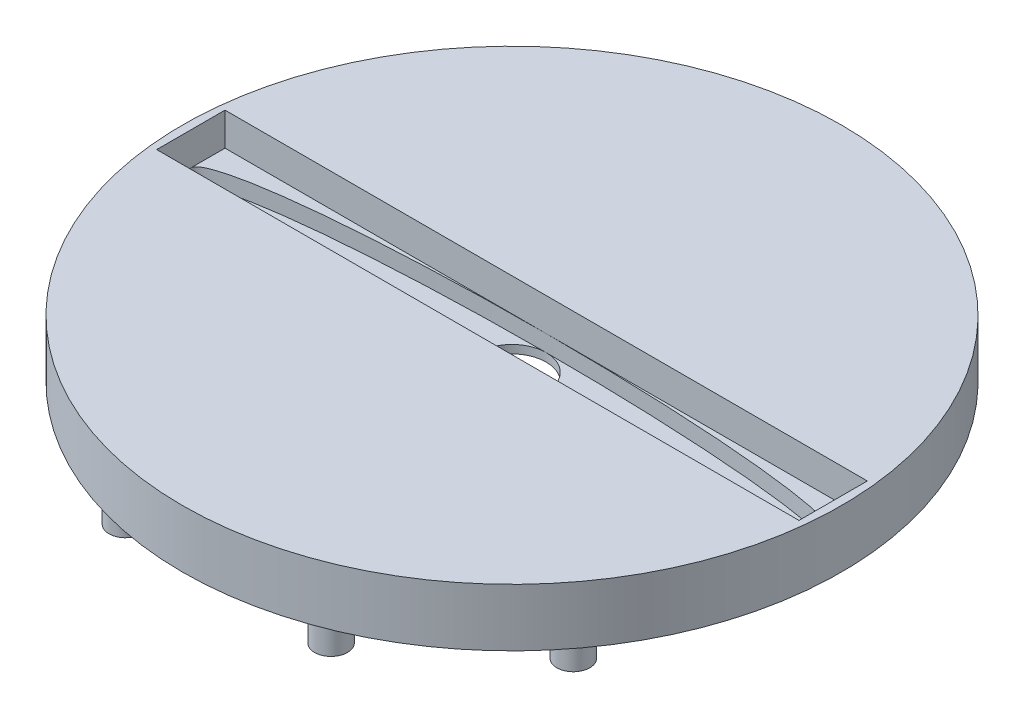
ISO-10303-21;
HEADER;
FILE_DESCRIPTION(('STEP AP214'),'2;1');
FILE_NAME('part.step','',(''),(''),'','','');
FILE_SCHEMA(('AUTOMOTIVE_DESIGN { 1 0 10303 214 1 1 1 1 }'));
ENDSEC;
DATA;
#1=APPLICATION_CONTEXT('core data for automotive mechanical design processes');
#2=APPLICATION_PROTOCOL_DEFINITION('international standard','automotive_design',2000,#1);
#3=PRODUCT_CONTEXT('',#1,'mechanical');
#4=PRODUCT('Part','Part','',(#3));
#5=PRODUCT_RELATED_PRODUCT_CATEGORY('part','',(#4));
#6=PRODUCT_DEFINITION_FORMATION('','',#4);
#7=PRODUCT_DEFINITION_CONTEXT('part definition',#1,'design');
#8=PRODUCT_DEFINITION('design','',#6,#7);
#9=PRODUCT_DEFINITION_SHAPE('','',#8);
#10=(LENGTH_UNIT() NAMED_UNIT(*) SI_UNIT(.MILLI.,.METRE.));
#11=(NAMED_UNIT(*) PLANE_ANGLE_UNIT() SI_UNIT($,.RADIAN.));
#12=(NAMED_UNIT(*) SI_UNIT($,.STERADIAN.) SOLID_ANGLE_UNIT());
#13=UNCERTAINTY_MEASURE_WITH_UNIT(LENGTH_MEASURE(1.E-05),#10,'distance_accuracy_value','');
#14=(GEOMETRIC_REPRESENTATION_CONTEXT(3) GLOBAL_UNCERTAINTY_ASSIGNED_CONTEXT((#13)) GLOBAL_UNIT_ASSIGNED_CONTEXT((#10,
#11,#12)) REPRESENTATION_CONTEXT('',''));
#15=CARTESIAN_POINT('',(0.,0.,0.));
#16=DIRECTION('',(0.,0.,1.));
#17=DIRECTION('',(1.,0.,0.));
#18=AXIS2_PLACEMENT_3D('',#15,#16,#17);
#19=CARTESIAN_POINT('',(0.,1.,0.));
#20=DIRECTION('',(0.,1.,0.));
#21=DIRECTION('',(0.,0.,1.));
#22=AXIS2_PLACEMENT_3D('',#19,#20,#21);
#23=PLANE('',#22);
#24=CARTESIAN_POINT('',(0.,1.,0.));
#25=DIRECTION('',(0.,1.,0.));
#26=DIRECTION('',(0.,0.,1.));
#27=AXIS2_PLACEMENT_3D('',#24,#25,#26);
#28=CIRCLE('',#27,4.15);
#29=CARTESIAN_POINT('',(0.,1.,4.15));
#30=VERTEX_POINT('',#29);
#31=CARTESIAN_POINT('',(0.,1.,-4.15));
#32=VERTEX_POINT('',#31);
#33=EDGE_CURVE('E77',#30,#32,#28,.T.);
#34=ORIENTED_EDGE('',*,*,#33,.F.);
#35=CARTESIAN_POINT('',(0.,1.,0.));
#36=DIRECTION('',(0.,1.,0.));
#37=DIRECTION('',(1.,0.,0.));
#38=AXIS2_PLACEMENT_3D('',#35,#36,#37);
#39=ELLIPSE('',#38,39.,4.15);
#40=EDGE_CURVE('E126',#30,#32,#39,.T.);
#41=ORIENTED_EDGE('',*,*,#40,.T.);
#42=EDGE_LOOP('',(#34,#41));
#43=FACE_BOUND('',#42,.T.);
#44=ADVANCED_FACE('F60',(#43),#23,.T.);
#45=CARTESIAN_POINT('',(0.,3.,0.));
#46=DIRECTION('',(0.,1.,0.));
#47=DIRECTION('',(0.,0.,1.));
#48=AXIS2_PLACEMENT_3D('',#45,#46,#47);
#49=PLANE('',#48);
#50=CARTESIAN_POINT('',(0.,3.,0.));
#51=DIRECTION('',(0.,1.,0.));
#52=DIRECTION('',(1.,0.,0.));
#53=AXIS2_PLACEMENT_3D('',#50,#51,#52);
#54=ELLIPSE('',#53,39.,4.15);
#55=CARTESIAN_POINT('',(39.,3.,0.));
#56=VERTEX_POINT('',#55);
#57=CARTESIAN_POINT('',(0.,3.,-4.15));
#58=VERTEX_POINT('',#57);
#59=EDGE_CURVE('E71',#56,#58,#54,.T.);
#60=ORIENTED_EDGE('',*,*,#59,.F.);
#61=DIRECTION('',(0.,0.,-1.));
#62=VECTOR('',#61,1.);
#63=CARTESIAN_POINT('',(39.,3.,0.));
#64=LINE('',#63,#62);
#65=CARTESIAN_POINT('',(39.,3.,-4.15));
#66=VERTEX_POINT('',#65);
#67=EDGE_CURVE('E496',#56,#66,#64,.T.);
#68=ORIENTED_EDGE('',*,*,#67,.T.);
#69=DIRECTION('',(1.,0.,0.));
#70=VECTOR('',#69,1.);
#71=CARTESIAN_POINT('',(0.,3.,-4.15));
#72=LINE('',#71,#70);
#73=EDGE_CURVE('E493',#58,#66,#72,.T.);
#74=ORIENTED_EDGE('',*,*,#73,.F.);
#75=EDGE_LOOP('',(#60,#68,#74));
#76=FACE_BOUND('',#75,.T.);
#77=ADVANCED_FACE('F148',(#76),#49,.T.);
#78=CARTESIAN_POINT('',(-39.,3.,0.));
#79=VERTEX_POINT('',#78);
#80=EDGE_CURVE('E12',#58,#79,#54,.T.);
#81=ORIENTED_EDGE('',*,*,#80,.F.);
#82=CARTESIAN_POINT('',(-39.,3.,-4.15));
#83=VERTEX_POINT('',#82);
#84=EDGE_CURVE('E490',#83,#58,#72,.T.);
#85=ORIENTED_EDGE('',*,*,#84,.F.);
#86=DIRECTION('',(0.,0.,-1.));
#87=VECTOR('',#86,1.);
#88=CARTESIAN_POINT('',(-39.,3.,0.));
#89=LINE('',#88,#87);
#90=EDGE_CURVE('E489',#79,#83,#89,.T.);
#91=ORIENTED_EDGE('',*,*,#90,.F.);
#92=EDGE_LOOP('',(#81,#85,#91));
#93=FACE_BOUND('',#92,.T.);
#94=ADVANCED_FACE('F211',(#93),#49,.T.);
#95=CARTESIAN_POINT('',(0.,3.,4.15));
#96=VERTEX_POINT('',#95);
#97=EDGE_CURVE('E69',#79,#96,#54,.T.);
#98=ORIENTED_EDGE('',*,*,#97,.F.);
#99=CARTESIAN_POINT('',(-39.,3.,4.15));
#100=VERTEX_POINT('',#99);
#101=EDGE_CURVE('E473',#100,#79,#89,.T.);
#102=ORIENTED_EDGE('',*,*,#101,.F.);
#103=DIRECTION('',(1.,0.,0.));
#104=VECTOR('',#103,1.);
#105=CARTESIAN_POINT('',(0.,3.,4.15));
#106=LINE('',#105,#104);
#107=EDGE_CURVE('E497',#100,#96,#106,.T.);
#108=ORIENTED_EDGE('',*,*,#107,.T.);
#109=EDGE_LOOP('',(#98,#102,#108));
#110=FACE_BOUND('',#109,.T.);
#111=ADVANCED_FACE('F149',(#110),#49,.T.);
#112=CARTESIAN_POINT('',(0.,7.,0.));
#113=DIRECTION('',(0.,-1.,0.));
#114=DIRECTION('',(0.,0.,-1.));
#115=AXIS2_PLACEMENT_3D('',#112,#113,#114);
#116=CYLINDRICAL_SURFACE('',#115,40.0200280181617);
#117=CARTESIAN_POINT('',(0.,7.,0.));
#118=DIRECTION('',(0.,1.,0.));
#119=DIRECTION('',(0.,0.,1.));
#120=AXIS2_PLACEMENT_3D('',#117,#118,#119);
#121=CIRCLE('',#120,40.0200280181617);
#122=CARTESIAN_POINT('',(0.,7.,40.0200280181617));
#123=VERTEX_POINT('',#122);
#124=EDGE_CURVE('E436',#123,#123,#121,.T.);
#125=ORIENTED_EDGE('',*,*,#124,.F.);
#126=EDGE_LOOP('',(#125));
#127=FACE_BOUND('',#126,.T.);
#128=CARTESIAN_POINT('',(0.,0.,0.));
#129=DIRECTION('',(0.,1.,0.));
#130=DIRECTION('',(0.,0.,1.));
#131=AXIS2_PLACEMENT_3D('',#128,#129,#130);
#132=CIRCLE('',#131,40.0200280181617);
#133=CARTESIAN_POINT('',(0.,0.,40.0200280181617));
#134=VERTEX_POINT('',#133);
#135=EDGE_CURVE('E439',#134,#134,#132,.T.);
#136=ORIENTED_EDGE('',*,*,#135,.T.);
#137=EDGE_LOOP('',(#136));
#138=FACE_BOUND('',#137,.T.);
#139=ADVANCED_FACE('F62',(#127,#138),#116,.T.);
#140=CARTESIAN_POINT('',(0.,7.,0.));
#141=DIRECTION('',(0.,1.,0.));
#142=DIRECTION('',(0.,0.,1.));
#143=AXIS2_PLACEMENT_3D('',#140,#141,#142);
#144=PLANE('',#143);
#145=DIRECTION('',(1.,0.,0.));
#146=VECTOR('',#145,1.);
#147=CARTESIAN_POINT('',(0.,7.,4.15));
#148=LINE('',#147,#146);
#149=CARTESIAN_POINT('',(-39.,7.,4.15));
#150=VERTEX_POINT('',#149);
#151=CARTESIAN_POINT('',(39.,7.,4.15));
#152=VERTEX_POINT('',#151);
#153=EDGE_CURVE('E133',#150,#152,#148,.T.);
#154=ORIENTED_EDGE('',*,*,#153,.F.);
#155=DIRECTION('',(0.,0.,-1.));
#156=VECTOR('',#155,1.);
#157=CARTESIAN_POINT('',(-39.,7.,0.));
#158=LINE('',#157,#156);
#159=CARTESIAN_POINT('',(-39.,7.,-4.15));
#160=VERTEX_POINT('',#159);
#161=EDGE_CURVE('E478',#150,#160,#158,.T.);
#162=ORIENTED_EDGE('',*,*,#161,.T.);
#163=DIRECTION('',(1.,0.,0.));
#164=VECTOR('',#163,1.);
#165=CARTESIAN_POINT('',(0.,7.,-4.15));
#166=LINE('',#165,#164);
#167=CARTESIAN_POINT('',(39.,7.,-4.15));
#168=VERTEX_POINT('',#167);
#169=EDGE_CURVE('E482',#160,#168,#166,.T.);
#170=ORIENTED_EDGE('',*,*,#169,.T.);
#171=DIRECTION('',(0.,0.,-1.));
#172=VECTOR('',#171,1.);
#173=CARTESIAN_POINT('',(39.,7.,0.));
#174=LINE('',#173,#172);
#175=EDGE_CURVE('E134',#152,#168,#174,.T.);
#176=ORIENTED_EDGE('',*,*,#175,.F.);
#177=EDGE_LOOP('',(#154,#162,#170,#176));
#178=FACE_BOUND('',#177,.T.);
#179=ORIENTED_EDGE('',*,*,#124,.T.);
#180=EDGE_LOOP('',(#179));
#181=FACE_BOUND('',#180,.T.);
#182=ADVANCED_FACE('F198',(#178,#181),#144,.T.);
#183=CARTESIAN_POINT('',(0.,0.,0.));
#184=DIRECTION('',(0.,1.,0.));
#185=DIRECTION('',(0.,0.,1.));
#186=AXIS2_PLACEMENT_3D('',#183,#184,#185);
#187=PLANE('',#186);
#188=CARTESIAN_POINT('',(0.,0.,0.));
#189=DIRECTION('',(0.,1.,0.));
#190=DIRECTION('',(0.,0.,1.));
#191=AXIS2_PLACEMENT_3D('',#188,#189,#190);
#192=CIRCLE('',#191,4.15);
#193=CARTESIAN_POINT('',(0.,0.,4.15));
#194=VERTEX_POINT('',#193);
#195=EDGE_CURVE('E64',#194,#194,#192,.T.);
#196=ORIENTED_EDGE('',*,*,#195,.T.);
#197=EDGE_LOOP('',(#196));
#198=FACE_BOUND('',#197,.T.);
#199=CARTESIAN_POINT('',(28.8041136156844,0.,21.3538282710135));
#200=DIRECTION('',(0.,1.,0.));
#201=DIRECTION('',(0.,0.,1.));
#202=AXIS2_PLACEMENT_3D('',#199,#200,#201);
#203=CIRCLE('',#202,2.);
#204=CARTESIAN_POINT('',(28.8041136156844,0.,23.3538282710135));
#205=VERTEX_POINT('',#204);
#206=EDGE_CURVE('E462',#205,#205,#203,.F.);
#207=ORIENTED_EDGE('',*,*,#206,.F.);
#208=EDGE_LOOP('',(#207));
#209=FACE_BOUND('',#208,.T.);
#210=CARTESIAN_POINT('',(12.4825942311787,0.,34.454465092986));
#211=DIRECTION('',(0.,1.,0.));
#212=DIRECTION('',(0.,0.,1.));
#213=AXIS2_PLACEMENT_3D('',#210,#211,#212);
#214=CIRCLE('',#213,2.);
#215=CARTESIAN_POINT('',(12.4825942311787,0.,36.454465092986));
#216=VERTEX_POINT('',#215);
#217=EDGE_CURVE('E456',#216,#216,#214,.F.);
#218=ORIENTED_EDGE('',*,*,#217,.F.);
#219=EDGE_LOOP('',(#218));
#220=FACE_BOUND('',#219,.T.);
#221=CARTESIAN_POINT('',(-12.4818038088544,0.,34.4538997085919));
#222=DIRECTION('',(0.,1.,0.));
#223=DIRECTION('',(0.,0.,1.));
#224=AXIS2_PLACEMENT_3D('',#221,#222,#223);
#225=CIRCLE('',#224,2.);
#226=CARTESIAN_POINT('',(-12.4818038088544,0.,36.4538997085919));
#227=VERTEX_POINT('',#226);
#228=EDGE_CURVE('E450',#227,#227,#225,.F.);
#229=ORIENTED_EDGE('',*,*,#228,.F.);
#230=EDGE_LOOP('',(#229));
#231=FACE_BOUND('',#230,.T.);
#232=CARTESIAN_POINT('',(-28.7461765816567,0.,21.4372461723639));
#233=DIRECTION('',(0.,1.,0.));
#234=DIRECTION('',(0.,0.,1.));
#235=AXIS2_PLACEMENT_3D('',#232,#233,#234);
#236=CIRCLE('',#235,2.00000000000001);
#237=CARTESIAN_POINT('',(-28.7461765816567,0.,23.4372461723639));
#238=VERTEX_POINT('',#237);
#239=EDGE_CURVE('E441',#238,#238,#236,.F.);
#240=ORIENTED_EDGE('',*,*,#239,.F.);
#241=EDGE_LOOP('',(#240));
#242=FACE_BOUND('',#241,.T.);
#243=ORIENTED_EDGE('',*,*,#135,.F.);
#244=EDGE_LOOP('',(#243));
#245=FACE_BOUND('',#244,.T.);
#246=ADVANCED_FACE('F193',(#198,#209,#220,#231,#242,#245),#187,.F.);
#247=CARTESIAN_POINT('',(0.,-4.,0.));
#248=DIRECTION('',(0.,1.,0.));
#249=DIRECTION('',(0.,0.,1.));
#250=AXIS2_PLACEMENT_3D('',#247,#248,#249);
#251=PLANE('',#250);
#252=CARTESIAN_POINT('',(-28.7461765816567,-4.,21.4372461723639));
#253=DIRECTION('',(0.,1.,0.));
#254=DIRECTION('',(0.,0.,1.));
#255=AXIS2_PLACEMENT_3D('',#252,#253,#254);
#256=CIRCLE('',#255,2.00000000000001);
#257=CARTESIAN_POINT('',(-28.7461765816567,-4.,23.4372461723639));
#258=VERTEX_POINT('',#257);
#259=EDGE_CURVE('E445',#258,#258,#256,.T.);
#260=ORIENTED_EDGE('',*,*,#259,.F.);
#261=EDGE_LOOP('',(#260));
#262=FACE_BOUND('',#261,.T.);
#263=ADVANCED_FACE('F190',(#262),#251,.F.);
#264=CARTESIAN_POINT('',(-28.7461765816567,7.,21.4372461723639));
#265=DIRECTION('',(0.,-1.,0.));
#266=DIRECTION('',(0.,0.,-1.));
#267=AXIS2_PLACEMENT_3D('',#264,#265,#266);
#268=CYLINDRICAL_SURFACE('',#267,2.00000000000001);
#269=ORIENTED_EDGE('',*,*,#259,.T.);
#270=EDGE_LOOP('',(#269));
#271=FACE_BOUND('',#270,.T.);
#272=ORIENTED_EDGE('',*,*,#239,.T.);
#273=EDGE_LOOP('',(#272));
#274=FACE_BOUND('',#273,.T.);
#275=ADVANCED_FACE('F188',(#271,#274),#268,.T.);
#276=CARTESIAN_POINT('',(0.,-4.,0.));
#277=DIRECTION('',(0.,1.,0.));
#278=DIRECTION('',(0.,0.,1.));
#279=AXIS2_PLACEMENT_3D('',#276,#277,#278);
#280=PLANE('',#279);
#281=CARTESIAN_POINT('',(-12.4818038088544,-4.,34.4538997085919));
#282=DIRECTION('',(0.,1.,0.));
#283=DIRECTION('',(0.,0.,1.));
#284=AXIS2_PLACEMENT_3D('',#281,#282,#283);
#285=CIRCLE('',#284,2.);
#286=CARTESIAN_POINT('',(-12.4818038088544,-4.,36.4538997085919));
#287=VERTEX_POINT('',#286);
#288=EDGE_CURVE('E453',#287,#287,#285,.T.);
#289=ORIENTED_EDGE('',*,*,#288,.F.);
#290=EDGE_LOOP('',(#289));
#291=FACE_BOUND('',#290,.T.);
#292=ADVANCED_FACE('F184',(#291),#280,.F.);
#293=CARTESIAN_POINT('',(-12.4818038088544,7.,34.4538997085919));
#294=DIRECTION('',(0.,-1.,0.));
#295=DIRECTION('',(0.,0.,-1.));
#296=AXIS2_PLACEMENT_3D('',#293,#294,#295);
#297=CYLINDRICAL_SURFACE('',#296,2.);
#298=ORIENTED_EDGE('',*,*,#288,.T.);
#299=EDGE_LOOP('',(#298));
#300=FACE_BOUND('',#299,.T.);
#301=ORIENTED_EDGE('',*,*,#228,.T.);
#302=EDGE_LOOP('',(#301));
#303=FACE_BOUND('',#302,.T.);
#304=ADVANCED_FACE('F180',(#300,#303),#297,.T.);
#305=CARTESIAN_POINT('',(0.,-4.,0.));
#306=DIRECTION('',(0.,1.,0.));
#307=DIRECTION('',(0.,0.,1.));
#308=AXIS2_PLACEMENT_3D('',#305,#306,#307);
#309=PLANE('',#308);
#310=CARTESIAN_POINT('',(12.4825942311787,-4.,34.454465092986));
#311=DIRECTION('',(0.,1.,0.));
#312=DIRECTION('',(0.,0.,1.));
#313=AXIS2_PLACEMENT_3D('',#310,#311,#312);
#314=CIRCLE('',#313,2.);
#315=CARTESIAN_POINT('',(12.4825942311787,-4.,36.454465092986));
#316=VERTEX_POINT('',#315);
#317=EDGE_CURVE('E459',#316,#316,#314,.T.);
#318=ORIENTED_EDGE('',*,*,#317,.F.);
#319=EDGE_LOOP('',(#318));
#320=FACE_BOUND('',#319,.T.);
#321=ADVANCED_FACE('F176',(#320),#309,.F.);
#322=CARTESIAN_POINT('',(12.4825942311787,7.,34.454465092986));
#323=DIRECTION('',(0.,-1.,0.));
#324=DIRECTION('',(0.,0.,-1.));
#325=AXIS2_PLACEMENT_3D('',#322,#323,#324);
#326=CYLINDRICAL_SURFACE('',#325,2.);
#327=ORIENTED_EDGE('',*,*,#317,.T.);
#328=EDGE_LOOP('',(#327));
#329=FACE_BOUND('',#328,.T.);
#330=ORIENTED_EDGE('',*,*,#217,.T.);
#331=EDGE_LOOP('',(#330));
#332=FACE_BOUND('',#331,.T.);
#333=ADVANCED_FACE('F172',(#329,#332),#326,.T.);
#334=CARTESIAN_POINT('',(0.,-4.,0.));
#335=DIRECTION('',(0.,1.,0.));
#336=DIRECTION('',(0.,0.,1.));
#337=AXIS2_PLACEMENT_3D('',#334,#335,#336);
#338=PLANE('',#337);
#339=CARTESIAN_POINT('',(28.8041136156844,-4.,21.3538282710135));
#340=DIRECTION('',(0.,1.,0.));
#341=DIRECTION('',(0.,0.,1.));
#342=AXIS2_PLACEMENT_3D('',#339,#340,#341);
#343=CIRCLE('',#342,2.);
#344=CARTESIAN_POINT('',(28.8041136156844,-4.,23.3538282710135));
#345=VERTEX_POINT('',#344);
#346=EDGE_CURVE('E465',#345,#345,#343,.T.);
#347=ORIENTED_EDGE('',*,*,#346,.F.);
#348=EDGE_LOOP('',(#347));
#349=FACE_BOUND('',#348,.T.);
#350=ADVANCED_FACE('F168',(#349),#338,.F.);
#351=CARTESIAN_POINT('',(28.8041136156844,7.,21.3538282710135));
#352=DIRECTION('',(0.,-1.,0.));
#353=DIRECTION('',(0.,0.,-1.));
#354=AXIS2_PLACEMENT_3D('',#351,#352,#353);
#355=CYLINDRICAL_SURFACE('',#354,2.);
#356=ORIENTED_EDGE('',*,*,#346,.T.);
#357=EDGE_LOOP('',(#356));
#358=FACE_BOUND('',#357,.T.);
#359=ORIENTED_EDGE('',*,*,#206,.T.);
#360=EDGE_LOOP('',(#359));
#361=FACE_BOUND('',#360,.T.);
#362=ADVANCED_FACE('F164',(#358,#361),#355,.T.);
#363=CARTESIAN_POINT('',(0.,3.,4.15));
#364=DIRECTION('',(0.,0.,1.));
#365=DIRECTION('',(1.,0.,0.));
#366=AXIS2_PLACEMENT_3D('',#363,#364,#365);
#367=PLANE('',#366);
#368=ORIENTED_EDGE('',*,*,#153,.T.);
#369=DIRECTION('',(0.,1.,0.));
#370=VECTOR('',#369,1.);
#371=CARTESIAN_POINT('',(39.,3.,4.15));
#372=LINE('',#371,#370);
#373=CARTESIAN_POINT('',(39.,3.,4.15));
#374=VERTEX_POINT('',#373);
#375=EDGE_CURVE('E469',#374,#152,#372,.T.);
#376=ORIENTED_EDGE('',*,*,#375,.F.);
#377=EDGE_CURVE('E481',#96,#374,#106,.T.);
#378=ORIENTED_EDGE('',*,*,#377,.F.);
#379=ORIENTED_EDGE('',*,*,#107,.F.);
#380=DIRECTION('',(0.,1.,0.));
#381=VECTOR('',#380,1.);
#382=CARTESIAN_POINT('',(-39.,3.,4.15));
#383=LINE('',#382,#381);
#384=EDGE_CURVE('E468',#100,#150,#383,.T.);
#385=ORIENTED_EDGE('',*,*,#384,.T.);
#386=EDGE_LOOP('',(#368,#376,#378,#379,#385));
#387=FACE_BOUND('',#386,.T.);
#388=ADVANCED_FACE('F154',(#387),#367,.F.);
#389=CARTESIAN_POINT('',(-39.,3.,0.));
#390=DIRECTION('',(1.,0.,0.));
#391=DIRECTION('',(0.,0.,-1.));
#392=AXIS2_PLACEMENT_3D('',#389,#390,#391);
#393=PLANE('',#392);
#394=ORIENTED_EDGE('',*,*,#161,.F.);
#395=ORIENTED_EDGE('',*,*,#384,.F.);
#396=ORIENTED_EDGE('',*,*,#101,.T.);
#397=ORIENTED_EDGE('',*,*,#90,.T.);
#398=DIRECTION('',(0.,1.,0.));
#399=VECTOR('',#398,1.);
#400=CARTESIAN_POINT('',(-39.,3.,-4.15));
#401=LINE('',#400,#399);
#402=EDGE_CURVE('E475',#83,#160,#401,.T.);
#403=ORIENTED_EDGE('',*,*,#402,.T.);
#404=EDGE_LOOP('',(#394,#395,#396,#397,#403));
#405=FACE_BOUND('',#404,.T.);
#406=ADVANCED_FACE('F150',(#405),#393,.T.);
#407=CARTESIAN_POINT('',(0.,3.,-4.15));
#408=DIRECTION('',(0.,0.,1.));
#409=DIRECTION('',(1.,0.,0.));
#410=AXIS2_PLACEMENT_3D('',#407,#408,#409);
#411=PLANE('',#410);
#412=ORIENTED_EDGE('',*,*,#169,.F.);
#413=ORIENTED_EDGE('',*,*,#402,.F.);
#414=ORIENTED_EDGE('',*,*,#84,.T.);
#415=ORIENTED_EDGE('',*,*,#73,.T.);
#416=DIRECTION('',(0.,1.,0.));
#417=VECTOR('',#416,1.);
#418=CARTESIAN_POINT('',(39.,3.,-4.15));
#419=LINE('',#418,#417);
#420=EDGE_CURVE('E472',#66,#168,#419,.T.);
#421=ORIENTED_EDGE('',*,*,#420,.T.);
#422=EDGE_LOOP('',(#412,#413,#414,#415,#421));
#423=FACE_BOUND('',#422,.T.);
#424=ADVANCED_FACE('F153',(#423),#411,.T.);
#425=CARTESIAN_POINT('',(39.,3.,0.));
#426=DIRECTION('',(1.,0.,0.));
#427=DIRECTION('',(0.,0.,-1.));
#428=AXIS2_PLACEMENT_3D('',#425,#426,#427);
#429=PLANE('',#428);
#430=ORIENTED_EDGE('',*,*,#175,.T.);
#431=ORIENTED_EDGE('',*,*,#420,.F.);
#432=ORIENTED_EDGE('',*,*,#67,.F.);
#433=EDGE_CURVE('E494',#374,#56,#64,.T.);
#434=ORIENTED_EDGE('',*,*,#433,.F.);
#435=ORIENTED_EDGE('',*,*,#375,.T.);
#436=EDGE_LOOP('',(#430,#431,#432,#434,#435));
#437=FACE_BOUND('',#436,.T.);
#438=ADVANCED_FACE('F146',(#437),#429,.F.);
#439=EDGE_CURVE('E442',#96,#56,#54,.T.);
#440=ORIENTED_EDGE('',*,*,#439,.F.);
#441=ORIENTED_EDGE('',*,*,#377,.T.);
#442=ORIENTED_EDGE('',*,*,#433,.T.);
#443=EDGE_LOOP('',(#440,#441,#442));
#444=FACE_BOUND('',#443,.T.);
#445=ADVANCED_FACE('F142',(#444),#49,.T.);
#446=DIRECTION('',(0.,1.,0.));
#447=VECTOR('',#446,1.);
#448=SURFACE_OF_LINEAR_EXTRUSION('',#39,#447);
#449=EDGE_CURVE('E130',#32,#30,#39,.T.);
#450=ORIENTED_EDGE('',*,*,#449,.F.);
#451=ORIENTED_EDGE('',*,*,#40,.F.);
#452=EDGE_LOOP('',(#450,#451));
#453=FACE_BOUND('',#452,.T.);
#454=ORIENTED_EDGE('',*,*,#59,.T.);
#455=ORIENTED_EDGE('',*,*,#80,.T.);
#456=ORIENTED_EDGE('',*,*,#97,.T.);
#457=ORIENTED_EDGE('',*,*,#439,.T.);
#458=EDGE_LOOP('',(#454,#455,#456,#457));
#459=FACE_BOUND('',#458,.T.);
#460=ADVANCED_FACE('F129',(#453,#459),#448,.F.);
#461=EDGE_CURVE('E117',#32,#30,#28,.T.);
#462=ORIENTED_EDGE('',*,*,#461,.F.);
#463=ORIENTED_EDGE('',*,*,#449,.T.);
#464=EDGE_LOOP('',(#462,#463));
#465=FACE_BOUND('',#464,.T.);
#466=ADVANCED_FACE('F132',(#465),#23,.T.);
#467=CARTESIAN_POINT('',(0.,-4.,0.));
#468=DIRECTION('',(0.,1.,0.));
#469=DIRECTION('',(0.,0.,1.));
#470=AXIS2_PLACEMENT_3D('',#467,#468,#469);
#471=CYLINDRICAL_SURFACE('',#470,4.15);
#472=ORIENTED_EDGE('',*,*,#33,.T.);
#473=ORIENTED_EDGE('',*,*,#461,.T.);
#474=EDGE_LOOP('',(#472,#473));
#475=FACE_BOUND('',#474,.T.);
#476=ORIENTED_EDGE('',*,*,#195,.F.);
#477=EDGE_LOOP('',(#476));
#478=FACE_BOUND('',#477,.T.);
#479=ADVANCED_FACE('F118',(#475,#478),#471,.F.);
#480=CLOSED_SHELL('',(#44,#77,#94,#111,#139,#182,#246,#263,#275,#292,#304,#321,#333,#350,#362,
#388,#406,#424,#438,#445,#460,#466,#479));
#481=MANIFOLD_SOLID_BREP('B2',#480);
#482=ADVANCED_BREP_SHAPE_REPRESENTATION('',(#18,#481),#14);
#483=SHAPE_DEFINITION_REPRESENTATION(#9,#482);
ENDSEC;
END-ISO-10303-21;
